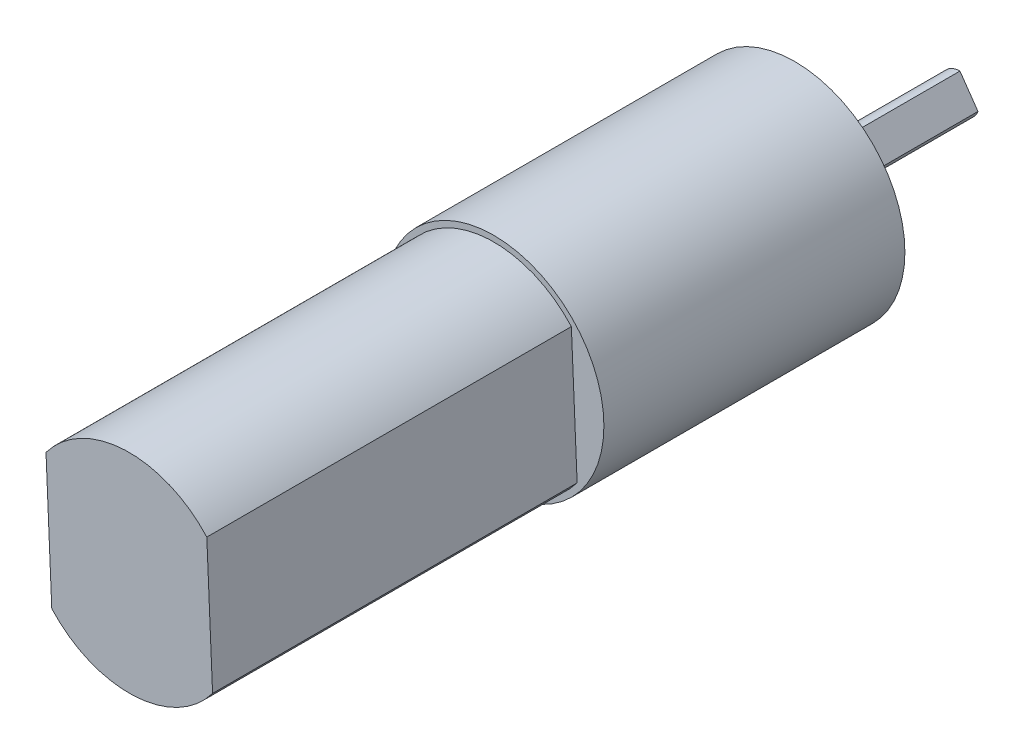
ISO-10303-21;
HEADER;
FILE_DESCRIPTION(('STEP AP214'),'2;1');
FILE_NAME('part.step','',(''),(''),'','','');
FILE_SCHEMA(('AUTOMOTIVE_DESIGN { 1 0 10303 214 1 1 1 1 }'));
ENDSEC;
DATA;
#1=APPLICATION_CONTEXT('core data for automotive mechanical design processes');
#2=APPLICATION_PROTOCOL_DEFINITION('international standard','automotive_design',2000,#1);
#3=PRODUCT_CONTEXT('',#1,'mechanical');
#4=PRODUCT('Part','Part','',(#3));
#5=PRODUCT_RELATED_PRODUCT_CATEGORY('part','',(#4));
#6=PRODUCT_DEFINITION_FORMATION('','',#4);
#7=PRODUCT_DEFINITION_CONTEXT('part definition',#1,'design');
#8=PRODUCT_DEFINITION('design','',#6,#7);
#9=PRODUCT_DEFINITION_SHAPE('','',#8);
#10=(LENGTH_UNIT() NAMED_UNIT(*) SI_UNIT(.MILLI.,.METRE.));
#11=(NAMED_UNIT(*) PLANE_ANGLE_UNIT() SI_UNIT($,.RADIAN.));
#12=(NAMED_UNIT(*) SI_UNIT($,.STERADIAN.) SOLID_ANGLE_UNIT());
#13=UNCERTAINTY_MEASURE_WITH_UNIT(LENGTH_MEASURE(1.E-05),#10,'distance_accuracy_value','');
#14=(GEOMETRIC_REPRESENTATION_CONTEXT(3) GLOBAL_UNCERTAINTY_ASSIGNED_CONTEXT((#13)) GLOBAL_UNIT_ASSIGNED_CONTEXT((#10,
#11,#12)) REPRESENTATION_CONTEXT('',''));
#15=CARTESIAN_POINT('',(0.,0.,0.));
#16=DIRECTION('',(0.,0.,1.));
#17=DIRECTION('',(1.,0.,0.));
#18=AXIS2_PLACEMENT_3D('',#15,#16,#17);
#19=CARTESIAN_POINT('',(0.,0.,-2.));
#20=DIRECTION('',(0.,0.,-1.));
#21=DIRECTION('',(-1.,0.,0.));
#22=AXIS2_PLACEMENT_3D('',#19,#20,#21);
#23=PLANE('',#22);
#24=CARTESIAN_POINT('',(0.,0.,-2.));
#25=DIRECTION('',(0.,0.,-1.));
#26=DIRECTION('',(-1.,0.,0.));
#27=AXIS2_PLACEMENT_3D('',#24,#25,#26);
#28=CIRCLE('',#27,2.835);
#29=CARTESIAN_POINT('',(-2.835,0.,-2.));
#30=VERTEX_POINT('',#29);
#31=EDGE_CURVE('E125',#30,#30,#28,.T.);
#32=ORIENTED_EDGE('',*,*,#31,.T.);
#33=EDGE_LOOP('',(#32));
#34=FACE_BOUND('',#33,.T.);
#35=DIRECTION('',(0.571428571428572,-0.82065180664829,0.));
#36=VECTOR('',#35,1.);
#37=CARTESIAN_POINT('',(0.,1.4,-2.));
#38=LINE('',#37,#36);
#39=CARTESIAN_POINT('',(0.,1.4,-2.));
#40=VERTEX_POINT('',#39);
#41=CARTESIAN_POINT('',(1.31304289063726,-0.485714285714285,-2.));
#42=VERTEX_POINT('',#41);
#43=EDGE_CURVE('E117',#40,#42,#38,.T.);
#44=ORIENTED_EDGE('',*,*,#43,.F.);
#45=CARTESIAN_POINT('',(0.,0.,-2.));
#46=DIRECTION('',(0.,0.,-1.));
#47=DIRECTION('',(-1.,0.,0.));
#48=AXIS2_PLACEMENT_3D('',#45,#46,#47);
#49=CIRCLE('',#48,1.4);
#50=EDGE_CURVE('E47',#42,#40,#49,.T.);
#51=ORIENTED_EDGE('',*,*,#50,.F.);
#52=EDGE_LOOP('',(#44,#51));
#53=FACE_BOUND('',#52,.T.);
#54=ADVANCED_FACE('F32',(#34,#53),#23,.T.);
#55=CARTESIAN_POINT('',(0.,0.,0.));
#56=DIRECTION('',(0.,0.,1.));
#57=DIRECTION('',(1.,0.,0.));
#58=AXIS2_PLACEMENT_3D('',#55,#56,#57);
#59=PLANE('',#58);
#60=CARTESIAN_POINT('',(5.5,0.,0.));
#61=DIRECTION('',(0.,0.,-1.));
#62=DIRECTION('',(-1.,0.,0.));
#63=AXIS2_PLACEMENT_3D('',#60,#61,#62);
#64=CIRCLE('',#63,1.02499999999999);
#65=CARTESIAN_POINT('',(4.47500000000001,0.,0.));
#66=VERTEX_POINT('',#65);
#67=EDGE_CURVE('E103',#66,#66,#64,.T.);
#68=ORIENTED_EDGE('',*,*,#67,.F.);
#69=EDGE_LOOP('',(#68));
#70=FACE_BOUND('',#69,.T.);
#71=CARTESIAN_POINT('',(-5.5,0.,0.));
#72=DIRECTION('',(0.,0.,-1.));
#73=DIRECTION('',(-1.,0.,0.));
#74=AXIS2_PLACEMENT_3D('',#71,#72,#73);
#75=CIRCLE('',#74,1.02499999999999);
#76=CARTESIAN_POINT('',(-6.52499999999999,0.,0.));
#77=VERTEX_POINT('',#76);
#78=EDGE_CURVE('E102',#77,#77,#75,.T.);
#79=ORIENTED_EDGE('',*,*,#78,.F.);
#80=EDGE_LOOP('',(#79));
#81=FACE_BOUND('',#80,.T.);
#82=CARTESIAN_POINT('',(0.,0.,0.));
#83=DIRECTION('',(0.,0.,1.));
#84=DIRECTION('',(1.,0.,0.));
#85=AXIS2_PLACEMENT_3D('',#82,#83,#84);
#86=CIRCLE('',#85,8.);
#87=CARTESIAN_POINT('',(8.,0.,0.));
#88=VERTEX_POINT('',#87);
#89=EDGE_CURVE('E155',#88,#88,#86,.T.);
#90=ORIENTED_EDGE('',*,*,#89,.F.);
#91=EDGE_LOOP('',(#90));
#92=FACE_BOUND('',#91,.T.);
#93=CARTESIAN_POINT('',(0.,0.,0.));
#94=DIRECTION('',(0.,0.,1.));
#95=DIRECTION('',(1.,0.,0.));
#96=AXIS2_PLACEMENT_3D('',#93,#94,#95);
#97=CIRCLE('',#96,2.835);
#98=CARTESIAN_POINT('',(2.835,0.,0.));
#99=VERTEX_POINT('',#98);
#100=EDGE_CURVE('E11',#99,#99,#97,.F.);
#101=ORIENTED_EDGE('',*,*,#100,.F.);
#102=EDGE_LOOP('',(#101));
#103=FACE_BOUND('',#102,.T.);
#104=ADVANCED_FACE('F161',(#70,#81,#92,#103),#59,.F.);
#105=CARTESIAN_POINT('',(0.,0.,21.88));
#106=DIRECTION('',(0.,0.,1.));
#107=DIRECTION('',(1.,0.,0.));
#108=AXIS2_PLACEMENT_3D('',#105,#106,#107);
#109=PLANE('',#108);
#110=CARTESIAN_POINT('',(0.,0.,21.88));
#111=DIRECTION('',(0.,0.,1.));
#112=DIRECTION('',(1.,0.,0.));
#113=AXIS2_PLACEMENT_3D('',#110,#111,#112);
#114=CIRCLE('',#113,8.);
#115=CARTESIAN_POINT('',(8.,0.,21.88));
#116=VERTEX_POINT('',#115);
#117=EDGE_CURVE('E40',#116,#116,#114,.T.);
#118=ORIENTED_EDGE('',*,*,#117,.T.);
#119=EDGE_LOOP('',(#118));
#120=FACE_BOUND('',#119,.T.);
#121=DIRECTION('',(0.0435516543188089,-0.999051176570097,0.));
#122=VECTOR('',#121,1.);
#123=CARTESIAN_POINT('',(-6.05437513335204,4.56080494481495,21.88));
#124=LINE('',#123,#122);
#125=CARTESIAN_POINT('',(-6.05437513335204,4.56080494481495,21.88));
#126=VERTEX_POINT('',#125);
#127=CARTESIAN_POINT('',(-5.63452363251809,-5.07035930034501,21.88));
#128=VERTEX_POINT('',#127);
#129=EDGE_CURVE('E142',#126,#128,#124,.T.);
#130=ORIENTED_EDGE('',*,*,#129,.F.);
#131=CARTESIAN_POINT('',(0.,0.,21.88));
#132=DIRECTION('',(0.,0.,1.));
#133=DIRECTION('',(1.,0.,0.));
#134=AXIS2_PLACEMENT_3D('',#131,#132,#133);
#135=CIRCLE('',#134,7.58);
#136=CARTESIAN_POINT('',(5.63452363251809,5.07035930034501,21.88));
#137=VERTEX_POINT('',#136);
#138=EDGE_CURVE('E128',#137,#126,#135,.T.);
#139=ORIENTED_EDGE('',*,*,#138,.F.);
#140=DIRECTION('',(-0.043551654318809,0.999051176570097,0.));
#141=VECTOR('',#140,1.);
#142=CARTESIAN_POINT('',(5.63452363251809,5.07035930034501,21.88));
#143=LINE('',#142,#141);
#144=CARTESIAN_POINT('',(6.05437513335204,-4.56080494481494,21.88));
#145=VERTEX_POINT('',#144);
#146=EDGE_CURVE('E133',#145,#137,#143,.T.);
#147=ORIENTED_EDGE('',*,*,#146,.F.);
#148=CARTESIAN_POINT('',(0.,0.,21.88));
#149=DIRECTION('',(0.,0.,1.));
#150=DIRECTION('',(1.,0.,0.));
#151=AXIS2_PLACEMENT_3D('',#148,#149,#150);
#152=CIRCLE('',#151,7.58);
#153=EDGE_CURVE('E144',#128,#145,#152,.T.);
#154=ORIENTED_EDGE('',*,*,#153,.F.);
#155=EDGE_LOOP('',(#130,#139,#147,#154));
#156=FACE_BOUND('',#155,.T.);
#157=ADVANCED_FACE('F164',(#120,#156),#109,.T.);
#158=CARTESIAN_POINT('',(0.,0.,21.88));
#159=DIRECTION('',(0.,0.,-1.));
#160=DIRECTION('',(-1.,0.,0.));
#161=AXIS2_PLACEMENT_3D('',#158,#159,#160);
#162=CYLINDRICAL_SURFACE('',#161,8.);
#163=ORIENTED_EDGE('',*,*,#117,.F.);
#164=EDGE_LOOP('',(#163));
#165=FACE_BOUND('',#164,.T.);
#166=ORIENTED_EDGE('',*,*,#89,.T.);
#167=EDGE_LOOP('',(#166));
#168=FACE_BOUND('',#167,.T.);
#169=ADVANCED_FACE('F34',(#165,#168),#162,.T.);
#170=CARTESIAN_POINT('',(0.,0.,48.38));
#171=DIRECTION('',(0.,0.,-1.));
#172=DIRECTION('',(-1.,0.,0.));
#173=AXIS2_PLACEMENT_3D('',#170,#171,#172);
#174=CYLINDRICAL_SURFACE('',#173,7.58);
#175=ORIENTED_EDGE('',*,*,#138,.T.);
#176=DIRECTION('',(0.,0.,-1.));
#177=VECTOR('',#176,1.);
#178=CARTESIAN_POINT('',(-6.05437513335204,4.56080494481495,48.38));
#179=LINE('',#178,#177);
#180=CARTESIAN_POINT('',(-6.05437513335204,4.56080494481495,48.38));
#181=VERTEX_POINT('',#180);
#182=EDGE_CURVE('E153',#181,#126,#179,.T.);
#183=ORIENTED_EDGE('',*,*,#182,.F.);
#184=CARTESIAN_POINT('',(0.,0.,48.38));
#185=DIRECTION('',(0.,0.,1.));
#186=DIRECTION('',(1.,0.,0.));
#187=AXIS2_PLACEMENT_3D('',#184,#185,#186);
#188=CIRCLE('',#187,7.58);
#189=CARTESIAN_POINT('',(5.63452363251809,5.07035930034501,48.38));
#190=VERTEX_POINT('',#189);
#191=EDGE_CURVE('E129',#190,#181,#188,.T.);
#192=ORIENTED_EDGE('',*,*,#191,.F.);
#193=DIRECTION('',(0.,0.,-1.));
#194=VECTOR('',#193,1.);
#195=CARTESIAN_POINT('',(5.63452363251809,5.07035930034501,48.38));
#196=LINE('',#195,#194);
#197=EDGE_CURVE('E139',#190,#137,#196,.T.);
#198=ORIENTED_EDGE('',*,*,#197,.T.);
#199=EDGE_LOOP('',(#175,#183,#192,#198));
#200=FACE_BOUND('',#199,.T.);
#201=ADVANCED_FACE('F281',(#200),#174,.T.);
#202=CARTESIAN_POINT('',(-6.05437513335204,4.56080494481495,48.38));
#203=DIRECTION('',(0.999051176570097,0.0435516543188089,0.));
#204=DIRECTION('',(-0.0435516543188089,0.999051176570097,0.));
#205=AXIS2_PLACEMENT_3D('',#202,#203,#204);
#206=PLANE('',#205);
#207=ORIENTED_EDGE('',*,*,#129,.T.);
#208=DIRECTION('',(0.,0.,-1.));
#209=VECTOR('',#208,1.);
#210=CARTESIAN_POINT('',(-5.63452363251809,-5.07035930034501,48.38));
#211=LINE('',#210,#209);
#212=CARTESIAN_POINT('',(-5.63452363251809,-5.07035930034501,48.38));
#213=VERTEX_POINT('',#212);
#214=EDGE_CURVE('E150',#213,#128,#211,.T.);
#215=ORIENTED_EDGE('',*,*,#214,.F.);
#216=DIRECTION('',(0.0435516543188089,-0.999051176570097,0.));
#217=VECTOR('',#216,1.);
#218=CARTESIAN_POINT('',(-6.05437513335204,4.56080494481495,48.38));
#219=LINE('',#218,#217);
#220=EDGE_CURVE('E132',#181,#213,#219,.T.);
#221=ORIENTED_EDGE('',*,*,#220,.F.);
#222=ORIENTED_EDGE('',*,*,#182,.T.);
#223=EDGE_LOOP('',(#207,#215,#221,#222));
#224=FACE_BOUND('',#223,.T.);
#225=ADVANCED_FACE('F271',(#224),#206,.F.);
#226=CARTESIAN_POINT('',(0.,0.,48.38));
#227=DIRECTION('',(0.,0.,-1.));
#228=DIRECTION('',(-1.,0.,0.));
#229=AXIS2_PLACEMENT_3D('',#226,#227,#228);
#230=CYLINDRICAL_SURFACE('',#229,7.58);
#231=ORIENTED_EDGE('',*,*,#153,.T.);
#232=DIRECTION('',(0.,0.,-1.));
#233=VECTOR('',#232,1.);
#234=CARTESIAN_POINT('',(6.05437513335204,-4.56080494481494,48.38));
#235=LINE('',#234,#233);
#236=CARTESIAN_POINT('',(6.05437513335204,-4.56080494481494,48.38));
#237=VERTEX_POINT('',#236);
#238=EDGE_CURVE('E55',#237,#145,#235,.T.);
#239=ORIENTED_EDGE('',*,*,#238,.F.);
#240=CARTESIAN_POINT('',(0.,0.,48.38));
#241=DIRECTION('',(0.,0.,1.));
#242=DIRECTION('',(1.,0.,0.));
#243=AXIS2_PLACEMENT_3D('',#240,#241,#242);
#244=CIRCLE('',#243,7.58);
#245=EDGE_CURVE('E135',#213,#237,#244,.T.);
#246=ORIENTED_EDGE('',*,*,#245,.F.);
#247=ORIENTED_EDGE('',*,*,#214,.T.);
#248=EDGE_LOOP('',(#231,#239,#246,#247));
#249=FACE_BOUND('',#248,.T.);
#250=ADVANCED_FACE('F262',(#249),#230,.T.);
#251=CARTESIAN_POINT('',(5.63452363251809,5.07035930034501,48.38));
#252=DIRECTION('',(-0.999051176570097,-0.043551654318809,0.));
#253=DIRECTION('',(0.043551654318809,-0.999051176570097,0.));
#254=AXIS2_PLACEMENT_3D('',#251,#252,#253);
#255=PLANE('',#254);
#256=ORIENTED_EDGE('',*,*,#146,.T.);
#257=ORIENTED_EDGE('',*,*,#197,.F.);
#258=DIRECTION('',(-0.043551654318809,0.999051176570097,0.));
#259=VECTOR('',#258,1.);
#260=CARTESIAN_POINT('',(5.63452363251809,5.07035930034501,48.38));
#261=LINE('',#260,#259);
#262=EDGE_CURVE('E137',#237,#190,#261,.T.);
#263=ORIENTED_EDGE('',*,*,#262,.F.);
#264=ORIENTED_EDGE('',*,*,#238,.T.);
#265=EDGE_LOOP('',(#256,#257,#263,#264));
#266=FACE_BOUND('',#265,.T.);
#267=ADVANCED_FACE('F180',(#266),#255,.F.);
#268=CARTESIAN_POINT('',(0.,0.,48.38));
#269=DIRECTION('',(0.,0.,1.));
#270=DIRECTION('',(1.,0.,0.));
#271=AXIS2_PLACEMENT_3D('',#268,#269,#270);
#272=PLANE('',#271);
#273=ORIENTED_EDGE('',*,*,#191,.T.);
#274=ORIENTED_EDGE('',*,*,#220,.T.);
#275=ORIENTED_EDGE('',*,*,#245,.T.);
#276=ORIENTED_EDGE('',*,*,#262,.T.);
#277=EDGE_LOOP('',(#273,#274,#275,#276));
#278=FACE_BOUND('',#277,.T.);
#279=ADVANCED_FACE('F171',(#278),#272,.T.);
#280=CARTESIAN_POINT('',(0.,0.,-2.));
#281=DIRECTION('',(0.,0.,1.));
#282=DIRECTION('',(1.,0.,0.));
#283=AXIS2_PLACEMENT_3D('',#280,#281,#282);
#284=CYLINDRICAL_SURFACE('',#283,2.835);
#285=ORIENTED_EDGE('',*,*,#31,.F.);
#286=EDGE_LOOP('',(#285));
#287=FACE_BOUND('',#286,.T.);
#288=ORIENTED_EDGE('',*,*,#100,.T.);
#289=EDGE_LOOP('',(#288));
#290=FACE_BOUND('',#289,.T.);
#291=ADVANCED_FACE('F168',(#287,#290),#284,.T.);
#292=CARTESIAN_POINT('',(0.,0.,-12.));
#293=DIRECTION('',(0.,0.,1.));
#294=DIRECTION('',(1.,0.,0.));
#295=AXIS2_PLACEMENT_3D('',#292,#293,#294);
#296=CYLINDRICAL_SURFACE('',#295,1.4);
#297=ORIENTED_EDGE('',*,*,#50,.T.);
#298=DIRECTION('',(0.,0.,1.));
#299=VECTOR('',#298,1.);
#300=CARTESIAN_POINT('',(0.,1.4,-12.));
#301=LINE('',#300,#299);
#302=CARTESIAN_POINT('',(0.,1.4,-12.));
#303=VERTEX_POINT('',#302);
#304=EDGE_CURVE('E123',#303,#40,#301,.T.);
#305=ORIENTED_EDGE('',*,*,#304,.F.);
#306=CARTESIAN_POINT('',(0.,0.,-12.));
#307=DIRECTION('',(0.,0.,-1.));
#308=DIRECTION('',(-1.,0.,0.));
#309=AXIS2_PLACEMENT_3D('',#306,#307,#308);
#310=CIRCLE('',#309,1.4);
#311=CARTESIAN_POINT('',(1.31304289063726,-0.485714285714285,-12.));
#312=VERTEX_POINT('',#311);
#313=EDGE_CURVE('E113',#312,#303,#310,.T.);
#314=ORIENTED_EDGE('',*,*,#313,.F.);
#315=DIRECTION('',(0.,0.,1.));
#316=VECTOR('',#315,1.);
#317=CARTESIAN_POINT('',(1.31304289063726,-0.485714285714285,-12.));
#318=LINE('',#317,#316);
#319=EDGE_CURVE('E119',#312,#42,#318,.T.);
#320=ORIENTED_EDGE('',*,*,#319,.T.);
#321=EDGE_LOOP('',(#297,#305,#314,#320));
#322=FACE_BOUND('',#321,.T.);
#323=ADVANCED_FACE('F170',(#322),#296,.T.);
#324=CARTESIAN_POINT('',(0.,1.4,-12.));
#325=DIRECTION('',(-0.82065180664829,-0.571428571428572,0.));
#326=DIRECTION('',(0.571428571428572,-0.82065180664829,0.));
#327=AXIS2_PLACEMENT_3D('',#324,#325,#326);
#328=PLANE('',#327);
#329=ORIENTED_EDGE('',*,*,#43,.T.);
#330=ORIENTED_EDGE('',*,*,#319,.F.);
#331=DIRECTION('',(0.571428571428572,-0.82065180664829,0.));
#332=VECTOR('',#331,1.);
#333=CARTESIAN_POINT('',(0.,1.4,-12.));
#334=LINE('',#333,#332);
#335=EDGE_CURVE('E116',#303,#312,#334,.T.);
#336=ORIENTED_EDGE('',*,*,#335,.F.);
#337=ORIENTED_EDGE('',*,*,#304,.T.);
#338=EDGE_LOOP('',(#329,#330,#336,#337));
#339=FACE_BOUND('',#338,.T.);
#340=ADVANCED_FACE('F178',(#339),#328,.F.);
#341=CARTESIAN_POINT('',(0.,0.,-12.));
#342=DIRECTION('',(0.,0.,-1.));
#343=DIRECTION('',(-1.,0.,0.));
#344=AXIS2_PLACEMENT_3D('',#341,#342,#343);
#345=PLANE('',#344);
#346=ORIENTED_EDGE('',*,*,#313,.T.);
#347=ORIENTED_EDGE('',*,*,#335,.T.);
#348=EDGE_LOOP('',(#346,#347));
#349=FACE_BOUND('',#348,.T.);
#350=ADVANCED_FACE('F193',(#349),#345,.T.);
#351=CARTESIAN_POINT('',(-5.5,0.,3.));
#352=DIRECTION('',(0.,0.,-1.));
#353=DIRECTION('',(-1.,0.,0.));
#354=AXIS2_PLACEMENT_3D('',#351,#352,#353);
#355=CONICAL_SURFACE('',#354,1.025,1.02974425867665);
#356=CARTESIAN_POINT('',(-5.5,0.,3.61588213450325));
#357=VERTEX_POINT('',#356);
#358=VERTEX_LOOP('',#357);
#359=FACE_BOUND('',#358,.T.);
#360=CARTESIAN_POINT('',(-5.5,0.,3.));
#361=DIRECTION('',(0.,0.,-1.));
#362=DIRECTION('',(-1.,0.,0.));
#363=AXIS2_PLACEMENT_3D('',#360,#361,#362);
#364=CIRCLE('',#363,1.025);
#365=CARTESIAN_POINT('',(-6.525,0.,3.));
#366=VERTEX_POINT('',#365);
#367=EDGE_CURVE('E106',#366,#366,#364,.T.);
#368=ORIENTED_EDGE('',*,*,#367,.T.);
#369=EDGE_LOOP('',(#368));
#370=FACE_BOUND('',#369,.T.);
#371=ADVANCED_FACE('F197',(#359,#370),#355,.F.);
#372=CARTESIAN_POINT('',(-5.5,0.,0.));
#373=DIRECTION('',(0.,0.,-1.));
#374=DIRECTION('',(-1.,0.,0.));
#375=AXIS2_PLACEMENT_3D('',#372,#373,#374);
#376=CYLINDRICAL_SURFACE('',#375,1.02499999999999);
#377=ORIENTED_EDGE('',*,*,#367,.F.);
#378=EDGE_LOOP('',(#377));
#379=FACE_BOUND('',#378,.T.);
#380=ORIENTED_EDGE('',*,*,#78,.T.);
#381=EDGE_LOOP('',(#380));
#382=FACE_BOUND('',#381,.T.);
#383=ADVANCED_FACE('F96',(#379,#382),#376,.F.);
#384=CARTESIAN_POINT('',(5.5,0.,3.));
#385=DIRECTION('',(0.,0.,-1.));
#386=DIRECTION('',(-1.,0.,0.));
#387=AXIS2_PLACEMENT_3D('',#384,#385,#386);
#388=CONICAL_SURFACE('',#387,1.025,1.02974425867665);
#389=CARTESIAN_POINT('',(5.5,0.,3.61588213450325));
#390=VERTEX_POINT('',#389);
#391=VERTEX_LOOP('',#390);
#392=FACE_BOUND('',#391,.T.);
#393=CARTESIAN_POINT('',(5.5,0.,3.));
#394=DIRECTION('',(0.,0.,-1.));
#395=DIRECTION('',(-1.,0.,0.));
#396=AXIS2_PLACEMENT_3D('',#393,#394,#395);
#397=CIRCLE('',#396,1.025);
#398=CARTESIAN_POINT('',(4.475,0.,3.));
#399=VERTEX_POINT('',#398);
#400=EDGE_CURVE('E100',#399,#399,#397,.T.);
#401=ORIENTED_EDGE('',*,*,#400,.T.);
#402=EDGE_LOOP('',(#401));
#403=FACE_BOUND('',#402,.T.);
#404=ADVANCED_FACE('F92',(#392,#403),#388,.F.);
#405=CARTESIAN_POINT('',(5.5,0.,0.));
#406=DIRECTION('',(0.,0.,-1.));
#407=DIRECTION('',(-1.,0.,0.));
#408=AXIS2_PLACEMENT_3D('',#405,#406,#407);
#409=CYLINDRICAL_SURFACE('',#408,1.02499999999999);
#410=ORIENTED_EDGE('',*,*,#400,.F.);
#411=EDGE_LOOP('',(#410));
#412=FACE_BOUND('',#411,.T.);
#413=ORIENTED_EDGE('',*,*,#67,.T.);
#414=EDGE_LOOP('',(#413));
#415=FACE_BOUND('',#414,.T.);
#416=ADVANCED_FACE('F95',(#412,#415),#409,.F.);
#417=CLOSED_SHELL('',(#54,#104,#157,#169,#201,#225,#250,#267,#279,#291,#323,#340,#350,#371,#383,
#404,#416));
#418=MANIFOLD_SOLID_BREP('B2',#417);
#419=ADVANCED_BREP_SHAPE_REPRESENTATION('',(#18,#418),#14);
#420=SHAPE_DEFINITION_REPRESENTATION(#9,#419);
ENDSEC;
END-ISO-10303-21;
